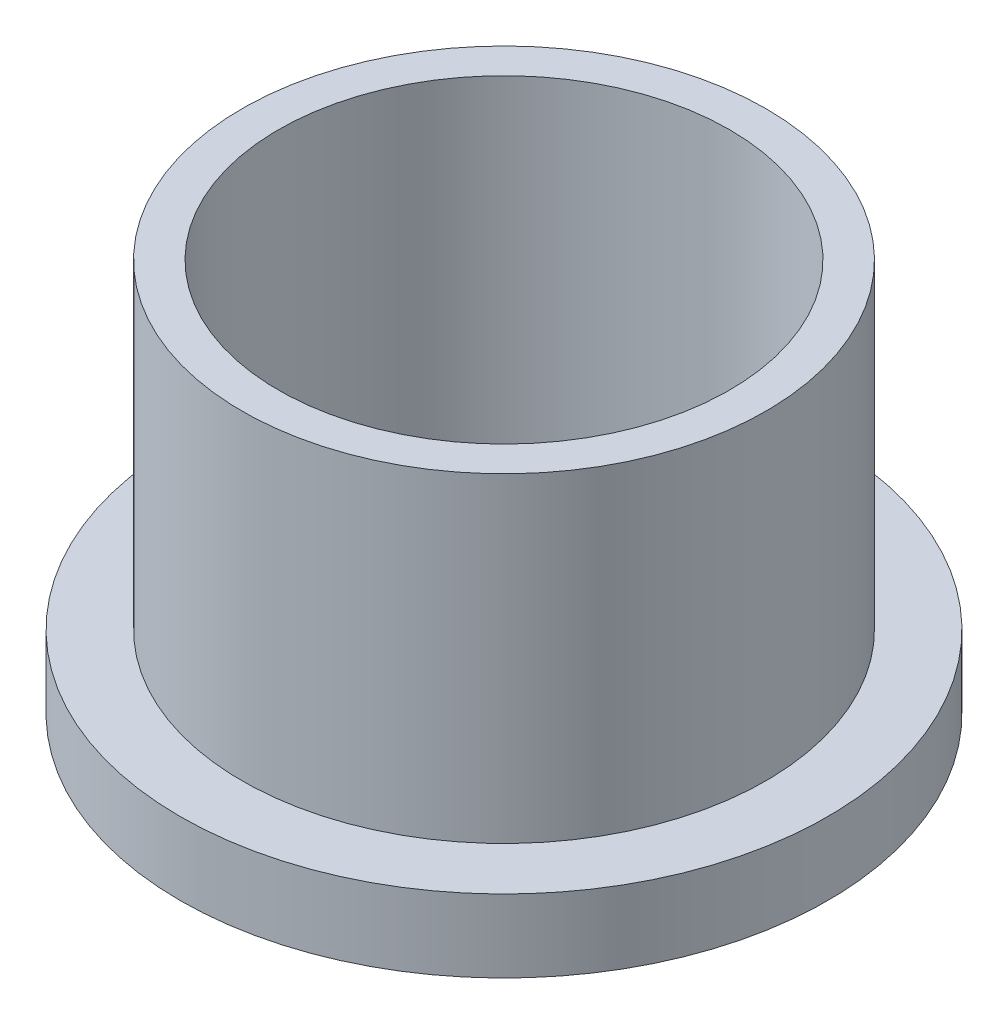
ISO-10303-21;
HEADER;
FILE_DESCRIPTION(('STEP AP214'),'2;1');
FILE_NAME('part.step','',(''),(''),'','','');
FILE_SCHEMA(('AUTOMOTIVE_DESIGN { 1 0 10303 214 1 1 1 1 }'));
ENDSEC;
DATA;
#1=APPLICATION_CONTEXT('core data for automotive mechanical design processes');
#2=APPLICATION_PROTOCOL_DEFINITION('international standard','automotive_design',2000,#1);
#3=PRODUCT_CONTEXT('',#1,'mechanical');
#4=PRODUCT('Part','Part','',(#3));
#5=PRODUCT_RELATED_PRODUCT_CATEGORY('part','',(#4));
#6=PRODUCT_DEFINITION_FORMATION('','',#4);
#7=PRODUCT_DEFINITION_CONTEXT('part definition',#1,'design');
#8=PRODUCT_DEFINITION('design','',#6,#7);
#9=PRODUCT_DEFINITION_SHAPE('','',#8);
#10=(LENGTH_UNIT() NAMED_UNIT(*) SI_UNIT(.MILLI.,.METRE.));
#11=(NAMED_UNIT(*) PLANE_ANGLE_UNIT() SI_UNIT($,.RADIAN.));
#12=(NAMED_UNIT(*) SI_UNIT($,.STERADIAN.) SOLID_ANGLE_UNIT());
#13=UNCERTAINTY_MEASURE_WITH_UNIT(LENGTH_MEASURE(1.E-05),#10,'distance_accuracy_value','');
#14=(GEOMETRIC_REPRESENTATION_CONTEXT(3) GLOBAL_UNCERTAINTY_ASSIGNED_CONTEXT((#13)) GLOBAL_UNIT_ASSIGNED_CONTEXT((#10,
#11,#12)) REPRESENTATION_CONTEXT('',''));
#15=CARTESIAN_POINT('',(0.,0.,0.));
#16=DIRECTION('',(0.,0.,1.));
#17=DIRECTION('',(1.,0.,0.));
#18=AXIS2_PLACEMENT_3D('',#15,#16,#17);
#19=CARTESIAN_POINT('',(0.,0.,0.));
#20=DIRECTION('',(0.,-1.,0.));
#21=DIRECTION('',(0.,0.,-1.));
#22=AXIS2_PLACEMENT_3D('',#19,#20,#21);
#23=CYLINDRICAL_SURFACE('',#22,31.);
#24=CARTESIAN_POINT('',(0.,0.,0.));
#25=DIRECTION('',(0.,-1.,0.));
#26=DIRECTION('',(0.,0.,-1.));
#27=AXIS2_PLACEMENT_3D('',#24,#25,#26);
#28=CIRCLE('',#27,31.);
#29=CARTESIAN_POINT('',(0.,0.,-31.));
#30=VERTEX_POINT('',#29);
#31=EDGE_CURVE('E10',#30,#30,#28,.T.);
#32=ORIENTED_EDGE('',*,*,#31,.T.);
#33=EDGE_LOOP('',(#32));
#34=FACE_BOUND('',#33,.T.);
#35=CARTESIAN_POINT('',(0.,54.,0.));
#36=DIRECTION('',(0.,-1.,0.));
#37=DIRECTION('',(0.,0.,-1.));
#38=AXIS2_PLACEMENT_3D('',#35,#36,#37);
#39=CIRCLE('',#38,31.);
#40=CARTESIAN_POINT('',(0.,54.,-31.));
#41=VERTEX_POINT('',#40);
#42=EDGE_CURVE('E67',#41,#41,#39,.T.);
#43=ORIENTED_EDGE('',*,*,#42,.F.);
#44=EDGE_LOOP('',(#43));
#45=FACE_BOUND('',#44,.T.);
#46=ADVANCED_FACE('F40',(#34,#45),#23,.F.);
#47=CARTESIAN_POINT('',(31.,0.,0.));
#48=DIRECTION('',(0.,-1.,0.));
#49=DIRECTION('',(0.,0.,-1.));
#50=AXIS2_PLACEMENT_3D('',#47,#48,#49);
#51=PLANE('',#50);
#52=CARTESIAN_POINT('',(0.,0.,0.));
#53=DIRECTION('',(0.,-1.,0.));
#54=DIRECTION('',(0.,0.,-1.));
#55=AXIS2_PLACEMENT_3D('',#52,#53,#54);
#56=CIRCLE('',#55,44.5);
#57=CARTESIAN_POINT('',(0.,0.,-44.5));
#58=VERTEX_POINT('',#57);
#59=EDGE_CURVE('E47',#58,#58,#56,.T.);
#60=ORIENTED_EDGE('',*,*,#59,.T.);
#61=EDGE_LOOP('',(#60));
#62=FACE_BOUND('',#61,.T.);
#63=ORIENTED_EDGE('',*,*,#31,.F.);
#64=EDGE_LOOP('',(#63));
#65=FACE_BOUND('',#64,.T.);
#66=ADVANCED_FACE('F76',(#62,#65),#51,.T.);
#67=CARTESIAN_POINT('',(0.,0.,0.));
#68=DIRECTION('',(0.,-1.,0.));
#69=DIRECTION('',(0.,0.,-1.));
#70=AXIS2_PLACEMENT_3D('',#67,#68,#69);
#71=CYLINDRICAL_SURFACE('',#70,44.5);
#72=CARTESIAN_POINT('',(0.,10.,0.));
#73=DIRECTION('',(0.,-1.,0.));
#74=DIRECTION('',(0.,0.,-1.));
#75=AXIS2_PLACEMENT_3D('',#72,#73,#74);
#76=CIRCLE('',#75,44.5);
#77=CARTESIAN_POINT('',(0.,10.,-44.5));
#78=VERTEX_POINT('',#77);
#79=EDGE_CURVE('E52',#78,#78,#76,.T.);
#80=ORIENTED_EDGE('',*,*,#79,.T.);
#81=EDGE_LOOP('',(#80));
#82=FACE_BOUND('',#81,.T.);
#83=ORIENTED_EDGE('',*,*,#59,.F.);
#84=EDGE_LOOP('',(#83));
#85=FACE_BOUND('',#84,.T.);
#86=ADVANCED_FACE('F80',(#82,#85),#71,.T.);
#87=CARTESIAN_POINT('',(44.5,10.,0.));
#88=DIRECTION('',(0.,1.,0.));
#89=DIRECTION('',(0.,0.,1.));
#90=AXIS2_PLACEMENT_3D('',#87,#88,#89);
#91=PLANE('',#90);
#92=CARTESIAN_POINT('',(0.,10.,0.));
#93=DIRECTION('',(0.,-1.,0.));
#94=DIRECTION('',(0.,0.,-1.));
#95=AXIS2_PLACEMENT_3D('',#92,#93,#94);
#96=CIRCLE('',#95,36.);
#97=CARTESIAN_POINT('',(0.,10.,-36.));
#98=VERTEX_POINT('',#97);
#99=EDGE_CURVE('E57',#98,#98,#96,.T.);
#100=ORIENTED_EDGE('',*,*,#99,.T.);
#101=EDGE_LOOP('',(#100));
#102=FACE_BOUND('',#101,.T.);
#103=ORIENTED_EDGE('',*,*,#79,.F.);
#104=EDGE_LOOP('',(#103));
#105=FACE_BOUND('',#104,.T.);
#106=ADVANCED_FACE('F84',(#102,#105),#91,.T.);
#107=CARTESIAN_POINT('',(0.,0.,0.));
#108=DIRECTION('',(0.,-1.,0.));
#109=DIRECTION('',(0.,0.,-1.));
#110=AXIS2_PLACEMENT_3D('',#107,#108,#109);
#111=CYLINDRICAL_SURFACE('',#110,36.);
#112=CARTESIAN_POINT('',(0.,54.,0.));
#113=DIRECTION('',(0.,-1.,0.));
#114=DIRECTION('',(0.,0.,-1.));
#115=AXIS2_PLACEMENT_3D('',#112,#113,#114);
#116=CIRCLE('',#115,36.);
#117=CARTESIAN_POINT('',(0.,54.,-36.));
#118=VERTEX_POINT('',#117);
#119=EDGE_CURVE('E63',#118,#118,#116,.T.);
#120=ORIENTED_EDGE('',*,*,#119,.T.);
#121=EDGE_LOOP('',(#120));
#122=FACE_BOUND('',#121,.T.);
#123=ORIENTED_EDGE('',*,*,#99,.F.);
#124=EDGE_LOOP('',(#123));
#125=FACE_BOUND('',#124,.T.);
#126=ADVANCED_FACE('F91',(#122,#125),#111,.T.);
#127=CARTESIAN_POINT('',(36.,54.,0.));
#128=DIRECTION('',(0.,1.,0.));
#129=DIRECTION('',(0.,0.,1.));
#130=AXIS2_PLACEMENT_3D('',#127,#128,#129);
#131=PLANE('',#130);
#132=ORIENTED_EDGE('',*,*,#42,.T.);
#133=EDGE_LOOP('',(#132));
#134=FACE_BOUND('',#133,.T.);
#135=ORIENTED_EDGE('',*,*,#119,.F.);
#136=EDGE_LOOP('',(#135));
#137=FACE_BOUND('',#136,.T.);
#138=ADVANCED_FACE('F72',(#134,#137),#131,.T.);
#139=CLOSED_SHELL('',(#46,#66,#86,#106,#126,#138));
#140=MANIFOLD_SOLID_BREP('B2',#139);
#141=ADVANCED_BREP_SHAPE_REPRESENTATION('',(#18,#140),#14);
#142=SHAPE_DEFINITION_REPRESENTATION(#9,#141);
ENDSEC;
END-ISO-10303-21;
